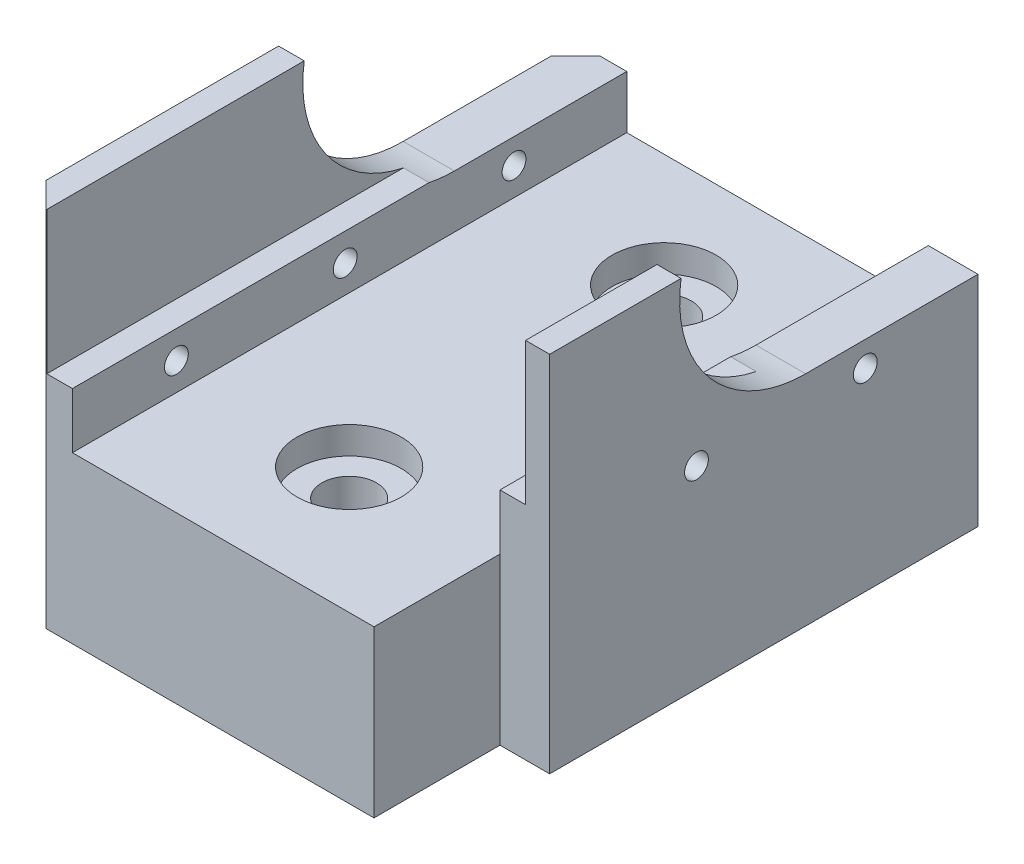
ISO-10303-21;
HEADER;
FILE_DESCRIPTION(('STEP AP214'),'2;1');
FILE_NAME('part.step','',(''),(''),'','','');
FILE_SCHEMA(('AUTOMOTIVE_DESIGN { 1 0 10303 214 1 1 1 1 }'));
ENDSEC;
DATA;
#1=APPLICATION_CONTEXT('core data for automotive mechanical design processes');
#2=APPLICATION_PROTOCOL_DEFINITION('international standard','automotive_design',2000,#1);
#3=PRODUCT_CONTEXT('',#1,'mechanical');
#4=PRODUCT('Part','Part','',(#3));
#5=PRODUCT_RELATED_PRODUCT_CATEGORY('part','',(#4));
#6=PRODUCT_DEFINITION_FORMATION('','',#4);
#7=PRODUCT_DEFINITION_CONTEXT('part definition',#1,'design');
#8=PRODUCT_DEFINITION('design','',#6,#7);
#9=PRODUCT_DEFINITION_SHAPE('','',#8);
#10=(LENGTH_UNIT() NAMED_UNIT(*) SI_UNIT(.MILLI.,.METRE.));
#11=(NAMED_UNIT(*) PLANE_ANGLE_UNIT() SI_UNIT($,.RADIAN.));
#12=(NAMED_UNIT(*) SI_UNIT($,.STERADIAN.) SOLID_ANGLE_UNIT());
#13=UNCERTAINTY_MEASURE_WITH_UNIT(LENGTH_MEASURE(1.E-05),#10,'distance_accuracy_value','');
#14=(GEOMETRIC_REPRESENTATION_CONTEXT(3) GLOBAL_UNCERTAINTY_ASSIGNED_CONTEXT((#13)) GLOBAL_UNIT_ASSIGNED_CONTEXT((#10,
#11,#12)) REPRESENTATION_CONTEXT('',''));
#15=CARTESIAN_POINT('',(0.,0.,0.));
#16=DIRECTION('',(0.,0.,1.));
#17=DIRECTION('',(1.,0.,0.));
#18=AXIS2_PLACEMENT_3D('',#15,#16,#17);
#19=CARTESIAN_POINT('',(15.1999954,27.305,-30.48));
#20=DIRECTION('',(1.,0.,0.));
#21=DIRECTION('',(0.,0.,-1.));
#22=AXIS2_PLACEMENT_3D('',#19,#20,#21);
#23=PLANE('',#22);
#24=CARTESIAN_POINT('',(15.1999954,10.16,-19.1188086));
#25=DIRECTION('',(1.,0.,0.));
#26=DIRECTION('',(0.,0.,-1.));
#27=AXIS2_PLACEMENT_3D('',#24,#25,#26);
#28=CIRCLE('',#27,1.19999999999999);
#29=CARTESIAN_POINT('',(15.1999954,10.16,-20.3188086));
#30=VERTEX_POINT('',#29);
#31=EDGE_CURVE('E260',#30,#30,#28,.T.);
#32=ORIENTED_EDGE('',*,*,#31,.T.);
#33=EDGE_LOOP('',(#32));
#34=FACE_BOUND('',#33,.T.);
#35=CARTESIAN_POINT('',(15.1999954,10.16,-2.1008086));
#36=DIRECTION('',(1.,0.,0.));
#37=DIRECTION('',(0.,0.,-1.));
#38=AXIS2_PLACEMENT_3D('',#35,#36,#37);
#39=CIRCLE('',#38,1.19999999999999);
#40=CARTESIAN_POINT('',(15.1999954,10.16,-3.3008086));
#41=VERTEX_POINT('',#40);
#42=EDGE_CURVE('E250',#41,#41,#39,.T.);
#43=ORIENTED_EDGE('',*,*,#42,.T.);
#44=EDGE_LOOP('',(#43));
#45=FACE_BOUND('',#44,.T.);
#46=DIRECTION('',(0.,-1.,0.));
#47=VECTOR('',#46,1.);
#48=CARTESIAN_POINT('',(15.1999954,-9.325,12.7000000000002));
#49=LINE('',#48,#47);
#50=CARTESIAN_POINT('',(15.1999954,12.9600198000048,12.7000000000002));
#51=VERTEX_POINT('',#50);
#52=CARTESIAN_POINT('',(15.1999954,7.3600056,12.7000000000002));
#53=VERTEX_POINT('',#52);
#54=EDGE_CURVE('E475',#51,#53,#49,.T.);
#55=ORIENTED_EDGE('',*,*,#54,.F.);
#56=DIRECTION('',(0.,0.,-1.));
#57=VECTOR('',#56,1.);
#58=CARTESIAN_POINT('',(15.1999954,12.9600198000048,-30.48));
#59=LINE('',#58,#57);
#60=CARTESIAN_POINT('',(15.1999954,12.9600198000048,-10.5482652898117));
#61=VERTEX_POINT('',#60);
#62=EDGE_CURVE('E268',#51,#61,#59,.T.);
#63=ORIENTED_EDGE('',*,*,#62,.T.);
#64=CARTESIAN_POINT('',(15.1999954,25.4,-13.105000048));
#65=DIRECTION('',(1.,0.,0.));
#66=DIRECTION('',(0.,0.,-1.));
#67=AXIS2_PLACEMENT_3D('',#64,#65,#66);
#68=CIRCLE('',#67,12.7);
#69=CARTESIAN_POINT('',(15.1999954,12.7,-13.105000048));
#70=VERTEX_POINT('',#69);
#71=EDGE_CURVE('E224',#61,#70,#68,.T.);
#72=ORIENTED_EDGE('',*,*,#71,.T.);
#73=DIRECTION('',(0.,0.,-1.));
#74=VECTOR('',#73,1.);
#75=CARTESIAN_POINT('',(15.1999954,12.7,-30.48));
#76=LINE('',#75,#74);
#77=CARTESIAN_POINT('',(15.1999954,12.7,-30.48));
#78=VERTEX_POINT('',#77);
#79=EDGE_CURVE('E273',#70,#78,#76,.T.);
#80=ORIENTED_EDGE('',*,*,#79,.T.);
#81=DIRECTION('',(0.,-1.,0.));
#82=VECTOR('',#81,1.);
#83=CARTESIAN_POINT('',(15.1999954,27.305,-30.48));
#84=LINE('',#83,#82);
#85=CARTESIAN_POINT('',(15.1999954,7.3600056,-30.48));
#86=VERTEX_POINT('',#85);
#87=EDGE_CURVE('E254',#78,#86,#84,.T.);
#88=ORIENTED_EDGE('',*,*,#87,.T.);
#89=DIRECTION('',(0.,0.,-1.));
#90=VECTOR('',#89,1.);
#91=CARTESIAN_POINT('',(15.1999954,7.3600056,30.4800000000251));
#92=LINE('',#91,#90);
#93=EDGE_CURVE('E320',#53,#86,#92,.T.);
#94=ORIENTED_EDGE('',*,*,#93,.F.);
#95=EDGE_LOOP('',(#55,#63,#72,#80,#88,#94));
#96=FACE_BOUND('',#95,.T.);
#97=ADVANCED_FACE('F41',(#34,#45,#96),#23,.F.);
#98=CARTESIAN_POINT('',(0.,27.305,0.));
#99=DIRECTION('',(0.,1.,0.));
#100=DIRECTION('',(0.,0.,1.));
#101=AXIS2_PLACEMENT_3D('',#98,#99,#100);
#102=PLANE('',#101);
#103=DIRECTION('',(0.,0.,-1.));
#104=VECTOR('',#103,1.);
#105=CARTESIAN_POINT('',(20.2059999740001,27.3050000000126,25.4000000000002));
#106=LINE('',#105,#104);
#107=CARTESIAN_POINT('',(20.2059999740001,27.3050000000126,12.7000000000002));
#108=VERTEX_POINT('',#107);
#109=CARTESIAN_POINT('',(20.2059999740001,27.3050000000126,-0.548687890365808));
#110=VERTEX_POINT('',#109);
#111=EDGE_CURVE('E56',#108,#110,#106,.T.);
#112=ORIENTED_EDGE('',*,*,#111,.T.);
#113=DIRECTION('',(1.,0.,0.));
#114=VECTOR('',#113,1.);
#115=CARTESIAN_POINT('',(-22.86,27.305,-0.548687890363903));
#116=LINE('',#115,#114);
#117=CARTESIAN_POINT('',(17.78,27.3050000000126,-0.548687890365808));
#118=VERTEX_POINT('',#117);
#119=EDGE_CURVE('E227',#118,#110,#116,.T.);
#120=ORIENTED_EDGE('',*,*,#119,.F.);
#121=DIRECTION('',(0.,0.,-1.));
#122=VECTOR('',#121,1.);
#123=CARTESIAN_POINT('',(17.78,27.3050000000126,400000.));
#124=LINE('',#123,#122);
#125=CARTESIAN_POINT('',(17.78,27.3050000000126,12.7000000000002));
#126=VERTEX_POINT('',#125);
#127=EDGE_CURVE('E234',#126,#118,#124,.T.);
#128=ORIENTED_EDGE('',*,*,#127,.F.);
#129=DIRECTION('',(-1.,0.,0.));
#130=VECTOR('',#129,1.);
#131=CARTESIAN_POINT('',(15.1999954,27.3050000000126,12.7000000000002));
#132=LINE('',#131,#130);
#133=EDGE_CURVE('E472',#108,#126,#132,.T.);
#134=ORIENTED_EDGE('',*,*,#133,.F.);
#135=EDGE_LOOP('',(#112,#120,#128,#134));
#136=FACE_BOUND('',#135,.T.);
#137=ADVANCED_FACE('F406',(#136),#102,.T.);
#138=CARTESIAN_POINT('',(17.78,0.,0.));
#139=DIRECTION('',(-1.,0.,0.));
#140=DIRECTION('',(0.,0.,1.));
#141=AXIS2_PLACEMENT_3D('',#138,#139,#140);
#142=PLANE('',#141);
#143=DIRECTION('',(0.,0.,1.));
#144=VECTOR('',#143,1.);
#145=CARTESIAN_POINT('',(17.78,12.9600198000048,400000.));
#146=LINE('',#145,#144);
#147=CARTESIAN_POINT('',(17.78,12.9600198000048,-10.5482652898117));
#148=VERTEX_POINT('',#147);
#149=CARTESIAN_POINT('',(17.78,12.9600198000048,12.6999999999953));
#150=VERTEX_POINT('',#149);
#151=EDGE_CURVE('E236',#148,#150,#146,.T.);
#152=ORIENTED_EDGE('',*,*,#151,.T.);
#153=DIRECTION('',(0.,1.,0.));
#154=VECTOR('',#153,1.);
#155=CARTESIAN_POINT('',(17.78,0.,12.7000000000002));
#156=LINE('',#155,#154);
#157=EDGE_CURVE('E480',#150,#126,#156,.T.);
#158=ORIENTED_EDGE('',*,*,#157,.T.);
#159=ORIENTED_EDGE('',*,*,#127,.T.);
#160=CARTESIAN_POINT('',(17.78,25.4,-13.105000048));
#161=DIRECTION('',(-1.,0.,0.));
#162=DIRECTION('',(0.,0.,1.));
#163=AXIS2_PLACEMENT_3D('',#160,#161,#162);
#164=CIRCLE('',#163,12.7);
#165=EDGE_CURVE('E221',#148,#118,#164,.T.);
#166=ORIENTED_EDGE('',*,*,#165,.F.);
#167=EDGE_LOOP('',(#152,#158,#159,#166));
#168=FACE_BOUND('',#167,.T.);
#169=ADVANCED_FACE('F413',(#168),#142,.T.);
#170=CARTESIAN_POINT('',(17.78,12.9600198000048,400000.));
#171=DIRECTION('',(0.,-1.,0.));
#172=DIRECTION('',(0.,0.,-1.));
#173=AXIS2_PLACEMENT_3D('',#170,#171,#172);
#174=PLANE('',#173);
#175=DIRECTION('',(-1.,0.,0.));
#176=VECTOR('',#175,1.);
#177=CARTESIAN_POINT('',(17.78,12.9600198000048,12.6999999999953));
#178=LINE('',#177,#176);
#179=EDGE_CURVE('E478',#150,#51,#178,.T.);
#180=ORIENTED_EDGE('',*,*,#179,.F.);
#181=ORIENTED_EDGE('',*,*,#151,.F.);
#182=DIRECTION('',(1.,0.,0.));
#183=VECTOR('',#182,1.);
#184=CARTESIAN_POINT('',(-22.86,12.9600198000048,-10.5482652898117));
#185=LINE('',#184,#183);
#186=EDGE_CURVE('E218',#148,#61,#185,.F.);
#187=ORIENTED_EDGE('',*,*,#186,.T.);
#188=ORIENTED_EDGE('',*,*,#62,.F.);
#189=EDGE_LOOP('',(#180,#181,#187,#188));
#190=FACE_BOUND('',#189,.T.);
#191=ADVANCED_FACE('F428',(#190),#174,.F.);
#192=CARTESIAN_POINT('',(-15.1999954,27.305,-30.48));
#193=DIRECTION('',(-1.,0.,0.));
#194=DIRECTION('',(0.,0.,1.));
#195=AXIS2_PLACEMENT_3D('',#192,#193,#194);
#196=PLANE('',#195);
#197=CARTESIAN_POINT('',(-15.1999954,10.16,-2.1008086));
#198=DIRECTION('',(-1.,0.,0.));
#199=DIRECTION('',(0.,0.,1.));
#200=AXIS2_PLACEMENT_3D('',#197,#198,#199);
#201=CIRCLE('',#200,1.19999999999999);
#202=CARTESIAN_POINT('',(-15.1999954,10.16,-0.900808600000012));
#203=VERTEX_POINT('',#202);
#204=EDGE_CURVE('E247',#203,#203,#201,.T.);
#205=ORIENTED_EDGE('',*,*,#204,.T.);
#206=EDGE_LOOP('',(#205));
#207=FACE_BOUND('',#206,.T.);
#208=CARTESIAN_POINT('',(-15.1999954,10.16,14.9171914));
#209=DIRECTION('',(-1.,0.,0.));
#210=DIRECTION('',(0.,0.,1.));
#211=AXIS2_PLACEMENT_3D('',#208,#209,#210);
#212=CIRCLE('',#211,1.19999999999999);
#213=CARTESIAN_POINT('',(-15.1999954,10.16,16.1171914));
#214=VERTEX_POINT('',#213);
#215=EDGE_CURVE('E253',#214,#214,#212,.T.);
#216=ORIENTED_EDGE('',*,*,#215,.T.);
#217=EDGE_LOOP('',(#216));
#218=FACE_BOUND('',#217,.T.);
#219=CARTESIAN_POINT('',(-15.1999954,10.16,-19.1188086));
#220=DIRECTION('',(-1.,0.,0.));
#221=DIRECTION('',(0.,0.,1.));
#222=AXIS2_PLACEMENT_3D('',#219,#220,#221);
#223=CIRCLE('',#222,1.19999999999999);
#224=CARTESIAN_POINT('',(-15.1999954,10.16,-17.9188086));
#225=VERTEX_POINT('',#224);
#226=EDGE_CURVE('E265',#225,#225,#223,.T.);
#227=ORIENTED_EDGE('',*,*,#226,.T.);
#228=EDGE_LOOP('',(#227));
#229=FACE_BOUND('',#228,.T.);
#230=DIRECTION('',(0.,1.,0.));
#231=VECTOR('',#230,1.);
#232=CARTESIAN_POINT('',(-15.1999954,27.305,25.4000000000001));
#233=LINE('',#232,#231);
#234=CARTESIAN_POINT('',(-15.1999954,7.3600056,25.4000000000001));
#235=VERTEX_POINT('',#234);
#236=CARTESIAN_POINT('',(-15.1999954,12.9600198000048,25.4000000000001));
#237=VERTEX_POINT('',#236);
#238=EDGE_CURVE('E317',#235,#237,#233,.T.);
#239=ORIENTED_EDGE('',*,*,#238,.F.);
#240=DIRECTION('',(0.,0.,1.));
#241=VECTOR('',#240,1.);
#242=CARTESIAN_POINT('',(-15.1999954,7.3600056,30.4800000000251));
#243=LINE('',#242,#241);
#244=CARTESIAN_POINT('',(-15.1999954,7.3600056,-30.48));
#245=VERTEX_POINT('',#244);
#246=EDGE_CURVE('E316',#245,#235,#243,.T.);
#247=ORIENTED_EDGE('',*,*,#246,.F.);
#248=DIRECTION('',(0.,-1.,0.));
#249=VECTOR('',#248,1.);
#250=CARTESIAN_POINT('',(-15.1999954,27.305,-30.48));
#251=LINE('',#250,#249);
#252=CARTESIAN_POINT('',(-15.1999954,12.7,-30.48));
#253=VERTEX_POINT('',#252);
#254=EDGE_CURVE('E257',#253,#245,#251,.T.);
#255=ORIENTED_EDGE('',*,*,#254,.F.);
#256=DIRECTION('',(0.,0.,1.));
#257=VECTOR('',#256,1.);
#258=CARTESIAN_POINT('',(-15.1999954,12.7,-30.48));
#259=LINE('',#258,#257);
#260=CARTESIAN_POINT('',(-15.1999954,12.7,-13.105000048));
#261=VERTEX_POINT('',#260);
#262=EDGE_CURVE('E230',#253,#261,#259,.T.);
#263=ORIENTED_EDGE('',*,*,#262,.T.);
#264=CARTESIAN_POINT('',(-15.1999954,25.4,-13.105000048));
#265=DIRECTION('',(-1.,0.,0.));
#266=DIRECTION('',(0.,0.,1.));
#267=AXIS2_PLACEMENT_3D('',#264,#265,#266);
#268=CIRCLE('',#267,12.7);
#269=CARTESIAN_POINT('',(-15.1999954,12.9600198000048,-10.5482652898117));
#270=VERTEX_POINT('',#269);
#271=EDGE_CURVE('E215',#261,#270,#268,.T.);
#272=ORIENTED_EDGE('',*,*,#271,.T.);
#273=DIRECTION('',(0.,0.,1.));
#274=VECTOR('',#273,1.);
#275=CARTESIAN_POINT('',(-15.1999954,12.9600198000048,-30.48));
#276=LINE('',#275,#274);
#277=EDGE_CURVE('E240',#270,#237,#276,.T.);
#278=ORIENTED_EDGE('',*,*,#277,.T.);
#279=EDGE_LOOP('',(#239,#247,#255,#263,#272,#278));
#280=FACE_BOUND('',#279,.T.);
#281=ADVANCED_FACE('F314',(#207,#218,#229,#280),#196,.F.);
#282=CARTESIAN_POINT('',(0.,27.305,0.));
#283=DIRECTION('',(0.,1.,0.));
#284=DIRECTION('',(0.,0.,1.));
#285=AXIS2_PLACEMENT_3D('',#282,#283,#284);
#286=PLANE('',#285);
#287=DIRECTION('',(0.,0.,1.));
#288=VECTOR('',#287,1.);
#289=CARTESIAN_POINT('',(-20.3599999999999,27.3050000000126,-30.48));
#290=LINE('',#289,#288);
#291=CARTESIAN_POINT('',(-20.3599999999999,27.3050000000126,-0.548687890365808));
#292=VERTEX_POINT('',#291);
#293=CARTESIAN_POINT('',(-20.3599999999999,27.3050000000126,22.9000000000002));
#294=VERTEX_POINT('',#293);
#295=EDGE_CURVE('E453',#292,#294,#290,.T.);
#296=ORIENTED_EDGE('',*,*,#295,.T.);
#297=DIRECTION('',(0.707106781186543,0.,0.707106781186552));
#298=VECTOR('',#297,1.);
#299=CARTESIAN_POINT('',(-21.6300000000002,27.305,21.6299999999999));
#300=LINE('',#299,#298);
#301=CARTESIAN_POINT('',(-17.8600000000002,27.3050000000126,25.4));
#302=VERTEX_POINT('',#301);
#303=EDGE_CURVE('E285',#294,#302,#300,.T.);
#304=ORIENTED_EDGE('',*,*,#303,.T.);
#305=DIRECTION('',(-1.,0.,0.));
#306=VECTOR('',#305,1.);
#307=CARTESIAN_POINT('',(-22.8599999999999,27.3050000000126,25.4));
#308=LINE('',#307,#306);
#309=CARTESIAN_POINT('',(-17.78,27.3050000000126,25.4));
#310=VERTEX_POINT('',#309);
#311=EDGE_CURVE('E483',#310,#302,#308,.T.);
#312=ORIENTED_EDGE('',*,*,#311,.F.);
#313=DIRECTION('',(0.,0.,-1.));
#314=VECTOR('',#313,1.);
#315=CARTESIAN_POINT('',(-17.78,27.3050000000126,400000.));
#316=LINE('',#315,#314);
#317=CARTESIAN_POINT('',(-17.78,27.3050000000126,-0.548687890365808));
#318=VERTEX_POINT('',#317);
#319=EDGE_CURVE('E233',#310,#318,#316,.T.);
#320=ORIENTED_EDGE('',*,*,#319,.T.);
#321=DIRECTION('',(1.,0.,0.));
#322=VECTOR('',#321,1.);
#323=CARTESIAN_POINT('',(-22.86,27.305,-0.548687890363903));
#324=LINE('',#323,#322);
#325=EDGE_CURVE('E213',#292,#318,#324,.T.);
#326=ORIENTED_EDGE('',*,*,#325,.F.);
#327=EDGE_LOOP('',(#296,#304,#312,#320,#326));
#328=FACE_BOUND('',#327,.T.);
#329=ADVANCED_FACE('F421',(#328),#286,.T.);
#330=DIRECTION('',(-1.,0.,0.));
#331=VECTOR('',#330,1.);
#332=CARTESIAN_POINT('',(17.7800000041279,12.9600198000048,25.3999999999905));
#333=LINE('',#332,#331);
#334=CARTESIAN_POINT('',(-17.78,12.9600198000048,25.3999999999902));
#335=VERTEX_POINT('',#334);
#336=EDGE_CURVE('E351',#237,#335,#333,.T.);
#337=ORIENTED_EDGE('',*,*,#336,.F.);
#338=ORIENTED_EDGE('',*,*,#277,.F.);
#339=DIRECTION('',(1.,0.,0.));
#340=VECTOR('',#339,1.);
#341=CARTESIAN_POINT('',(-22.86,12.9600198000048,-10.5482652898117));
#342=LINE('',#341,#340);
#343=CARTESIAN_POINT('',(-17.78,12.9600198000048,-10.5482652898117));
#344=VERTEX_POINT('',#343);
#345=EDGE_CURVE('E209',#270,#344,#342,.F.);
#346=ORIENTED_EDGE('',*,*,#345,.T.);
#347=DIRECTION('',(0.,0.,1.));
#348=VECTOR('',#347,1.);
#349=CARTESIAN_POINT('',(-17.78,12.9600198000048,400000.));
#350=LINE('',#349,#348);
#351=EDGE_CURVE('E237',#344,#335,#350,.T.);
#352=ORIENTED_EDGE('',*,*,#351,.T.);
#353=EDGE_LOOP('',(#337,#338,#346,#352));
#354=FACE_BOUND('',#353,.T.);
#355=ADVANCED_FACE('F424',(#354),#174,.F.);
#356=CARTESIAN_POINT('',(-17.78,0.,0.));
#357=DIRECTION('',(-1.,0.,0.));
#358=DIRECTION('',(0.,0.,1.));
#359=AXIS2_PLACEMENT_3D('',#356,#357,#358);
#360=PLANE('',#359);
#361=DIRECTION('',(0.,1.,0.));
#362=VECTOR('',#361,1.);
#363=CARTESIAN_POINT('',(-17.78,0.,25.4));
#364=LINE('',#363,#362);
#365=EDGE_CURVE('E346',#335,#310,#364,.T.);
#366=ORIENTED_EDGE('',*,*,#365,.F.);
#367=ORIENTED_EDGE('',*,*,#351,.F.);
#368=CARTESIAN_POINT('',(-17.78,25.4,-13.105000048));
#369=DIRECTION('',(-1.,0.,0.));
#370=DIRECTION('',(0.,0.,1.));
#371=AXIS2_PLACEMENT_3D('',#368,#369,#370);
#372=CIRCLE('',#371,12.7);
#373=EDGE_CURVE('E270',#344,#318,#372,.T.);
#374=ORIENTED_EDGE('',*,*,#373,.T.);
#375=ORIENTED_EDGE('',*,*,#319,.F.);
#376=EDGE_LOOP('',(#366,#367,#374,#375));
#377=FACE_BOUND('',#376,.T.);
#378=ADVANCED_FACE('F493',(#377),#360,.F.);
#379=CARTESIAN_POINT('',(0.,-9.325,0.));
#380=DIRECTION('',(0.,-1.,0.));
#381=DIRECTION('',(0.,0.,-1.));
#382=AXIS2_PLACEMENT_3D('',#379,#380,#381);
#383=PLANE('',#382);
#384=DIRECTION('',(0.,0.,-1.));
#385=VECTOR('',#384,1.);
#386=CARTESIAN_POINT('',(20.2059999740001,-9.325,25.4000000000002));
#387=LINE('',#386,#385);
#388=CARTESIAN_POINT('',(20.2059999740001,-9.325,12.7000000000002));
#389=VERTEX_POINT('',#388);
#390=CARTESIAN_POINT('',(20.2059999740001,-9.325,-30.48));
#391=VERTEX_POINT('',#390);
#392=EDGE_CURVE('E173',#389,#391,#387,.T.);
#393=ORIENTED_EDGE('',*,*,#392,.F.);
#394=DIRECTION('',(1.,0.,0.));
#395=VECTOR('',#394,1.);
#396=CARTESIAN_POINT('',(15.1999954,-9.325,12.7000000000002));
#397=LINE('',#396,#395);
#398=CARTESIAN_POINT('',(15.1999954,-9.325,12.7000000000002));
#399=VERTEX_POINT('',#398);
#400=EDGE_CURVE('E470',#399,#389,#397,.T.);
#401=ORIENTED_EDGE('',*,*,#400,.F.);
#402=DIRECTION('',(0.,0.,1.));
#403=VECTOR('',#402,1.);
#404=CARTESIAN_POINT('',(15.1999954,-9.325,12.7000000000002));
#405=LINE('',#404,#403);
#406=CARTESIAN_POINT('',(15.1999954,-9.325,25.4000000000002));
#407=VERTEX_POINT('',#406);
#408=EDGE_CURVE('E476',#399,#407,#405,.T.);
#409=ORIENTED_EDGE('',*,*,#408,.T.);
#410=DIRECTION('',(-1.,0.,0.));
#411=VECTOR('',#410,1.);
#412=CARTESIAN_POINT('',(-2.62135991925387E-13,-9.325,25.4000000000002));
#413=LINE('',#412,#411);
#414=CARTESIAN_POINT('',(-17.8600000000002,-9.325,25.4));
#415=VERTEX_POINT('',#414);
#416=EDGE_CURVE('E342',#407,#415,#413,.T.);
#417=ORIENTED_EDGE('',*,*,#416,.T.);
#418=DIRECTION('',(-0.707106781186543,0.,-0.707106781186552));
#419=VECTOR('',#418,1.);
#420=CARTESIAN_POINT('',(-21.6300000000002,-9.325,21.6299999999999));
#421=LINE('',#420,#419);
#422=CARTESIAN_POINT('',(-20.3599999999999,-9.325,22.9000000000002));
#423=VERTEX_POINT('',#422);
#424=EDGE_CURVE('E290',#415,#423,#421,.T.);
#425=ORIENTED_EDGE('',*,*,#424,.T.);
#426=DIRECTION('',(0.,0.,1.));
#427=VECTOR('',#426,1.);
#428=CARTESIAN_POINT('',(-20.3599999999999,-9.325,-30.48));
#429=LINE('',#428,#427);
#430=CARTESIAN_POINT('',(-20.3599999999999,-9.325,-27.98));
#431=VERTEX_POINT('',#430);
#432=EDGE_CURVE('E307',#431,#423,#429,.T.);
#433=ORIENTED_EDGE('',*,*,#432,.F.);
#434=DIRECTION('',(-0.707106781186547,0.,0.707106781186548));
#435=VECTOR('',#434,1.);
#436=CARTESIAN_POINT('',(-24.17,-9.325,-24.1699999999999));
#437=LINE('',#436,#435);
#438=CARTESIAN_POINT('',(-17.86,-9.325,-30.48));
#439=VERTEX_POINT('',#438);
#440=EDGE_CURVE('E196',#431,#439,#437,.F.);
#441=ORIENTED_EDGE('',*,*,#440,.T.);
#442=DIRECTION('',(1.,0.,0.));
#443=VECTOR('',#442,1.);
#444=CARTESIAN_POINT('',(-22.86,-9.325,-30.48));
#445=LINE('',#444,#443);
#446=EDGE_CURVE('E188',#439,#391,#445,.T.);
#447=ORIENTED_EDGE('',*,*,#446,.T.);
#448=EDGE_LOOP('',(#393,#401,#409,#417,#425,#433,#441,#447));
#449=FACE_BOUND('',#448,.T.);
#450=CARTESIAN_POINT('',(0.,-9.325,12.7));
#451=DIRECTION('',(0.,1.,0.));
#452=DIRECTION('',(0.,0.,1.));
#453=AXIS2_PLACEMENT_3D('',#450,#451,#452);
#454=CIRCLE('',#453,2.75);
#455=CARTESIAN_POINT('',(0.,-9.325,15.45));
#456=VERTEX_POINT('',#455);
#457=EDGE_CURVE('E360',#456,#456,#454,.T.);
#458=ORIENTED_EDGE('',*,*,#457,.T.);
#459=EDGE_LOOP('',(#458));
#460=FACE_BOUND('',#459,.T.);
#461=CARTESIAN_POINT('',(0.,-9.325,-19.05));
#462=DIRECTION('',(0.,1.,0.));
#463=DIRECTION('',(0.,0.,1.));
#464=AXIS2_PLACEMENT_3D('',#461,#462,#463);
#465=CIRCLE('',#464,2.75);
#466=CARTESIAN_POINT('',(0.,-9.325,-16.3));
#467=VERTEX_POINT('',#466);
#468=EDGE_CURVE('E321',#467,#467,#465,.T.);
#469=ORIENTED_EDGE('',*,*,#468,.T.);
#470=EDGE_LOOP('',(#469));
#471=FACE_BOUND('',#470,.T.);
#472=ADVANCED_FACE('F192',(#449,#460,#471),#383,.T.);
#473=CARTESIAN_POINT('',(0.,7.3600056,0.));
#474=DIRECTION('',(0.,-1.,0.));
#475=DIRECTION('',(0.,0.,-1.));
#476=AXIS2_PLACEMENT_3D('',#473,#474,#475);
#477=PLANE('',#476);
#478=CARTESIAN_POINT('',(0.,7.3600056,-19.05));
#479=DIRECTION('',(0.,1.,0.));
#480=DIRECTION('',(0.,0.,1.));
#481=AXIS2_PLACEMENT_3D('',#478,#479,#480);
#482=CIRCLE('',#481,5.24999999999999);
#483=CARTESIAN_POINT('',(0.,7.3600056,-13.8));
#484=VERTEX_POINT('',#483);
#485=EDGE_CURVE('E363',#484,#484,#482,.T.);
#486=ORIENTED_EDGE('',*,*,#485,.F.);
#487=EDGE_LOOP('',(#486));
#488=FACE_BOUND('',#487,.T.);
#489=CARTESIAN_POINT('',(0.,7.3600056,12.7));
#490=DIRECTION('',(0.,1.,0.));
#491=DIRECTION('',(0.,0.,1.));
#492=AXIS2_PLACEMENT_3D('',#489,#490,#491);
#493=CIRCLE('',#492,5.24999999999999);
#494=CARTESIAN_POINT('',(0.,7.3600056,17.95));
#495=VERTEX_POINT('',#494);
#496=EDGE_CURVE('E345',#495,#495,#493,.T.);
#497=ORIENTED_EDGE('',*,*,#496,.F.);
#498=EDGE_LOOP('',(#497));
#499=FACE_BOUND('',#498,.T.);
#500=DIRECTION('',(-1.,0.,0.));
#501=VECTOR('',#500,1.);
#502=CARTESIAN_POINT('',(-2.62135991925387E-13,7.3600056,25.4000000000002));
#503=LINE('',#502,#501);
#504=CARTESIAN_POINT('',(15.1999954,7.3600056,25.4000000000002));
#505=VERTEX_POINT('',#504);
#506=EDGE_CURVE('E276',#505,#235,#503,.T.);
#507=ORIENTED_EDGE('',*,*,#506,.F.);
#508=EDGE_CURVE('E204',#505,#53,#92,.T.);
#509=ORIENTED_EDGE('',*,*,#508,.T.);
#510=ORIENTED_EDGE('',*,*,#93,.T.);
#511=DIRECTION('',(-1.,0.,0.));
#512=VECTOR('',#511,1.);
#513=CARTESIAN_POINT('',(-15.1999954,7.3600056,-30.48));
#514=LINE('',#513,#512);
#515=EDGE_CURVE('E198',#86,#245,#514,.T.);
#516=ORIENTED_EDGE('',*,*,#515,.T.);
#517=ORIENTED_EDGE('',*,*,#246,.T.);
#518=EDGE_LOOP('',(#507,#509,#510,#516,#517));
#519=FACE_BOUND('',#518,.T.);
#520=ADVANCED_FACE('F328',(#488,#499,#519),#477,.F.);
#521=CARTESIAN_POINT('',(22.86,10.16,-19.1188086));
#522=DIRECTION('',(1.,0.,0.));
#523=DIRECTION('',(0.,0.,-1.));
#524=AXIS2_PLACEMENT_3D('',#521,#522,#523);
#525=CYLINDRICAL_SURFACE('',#524,1.19999999999999);
#526=CARTESIAN_POINT('',(-20.3599999999999,10.16,-19.1188086));
#527=DIRECTION('',(1.,0.,0.));
#528=DIRECTION('',(0.,1.,0.));
#529=AXIS2_PLACEMENT_3D('',#526,#527,#528);
#530=CIRCLE('',#529,1.19999999999999);
#531=CARTESIAN_POINT('',(-20.3599999999999,11.36,-19.1188086));
#532=VERTEX_POINT('',#531);
#533=EDGE_CURVE('E467',#532,#532,#530,.F.);
#534=ORIENTED_EDGE('',*,*,#533,.T.);
#535=EDGE_LOOP('',(#534));
#536=FACE_BOUND('',#535,.T.);
#537=ORIENTED_EDGE('',*,*,#226,.F.);
#538=EDGE_LOOP('',(#537));
#539=FACE_BOUND('',#538,.T.);
#540=ADVANCED_FACE('F388',(#536,#539),#525,.F.);
#541=CARTESIAN_POINT('',(22.86,10.16,-19.1188086));
#542=DIRECTION('',(1.,0.,0.));
#543=DIRECTION('',(0.,0.,-1.));
#544=AXIS2_PLACEMENT_3D('',#541,#542,#543);
#545=CYLINDRICAL_SURFACE('',#544,1.19999999999999);
#546=CARTESIAN_POINT('',(20.2059999740001,10.16,-19.1188086));
#547=DIRECTION('',(-1.,0.,0.));
#548=DIRECTION('',(0.,0.,1.));
#549=AXIS2_PLACEMENT_3D('',#546,#547,#548);
#550=CIRCLE('',#549,1.19999999999999);
#551=CARTESIAN_POINT('',(20.2059999740001,10.16,-17.9188086));
#552=VERTEX_POINT('',#551);
#553=EDGE_CURVE('E455',#552,#552,#550,.F.);
#554=ORIENTED_EDGE('',*,*,#553,.T.);
#555=EDGE_LOOP('',(#554));
#556=FACE_BOUND('',#555,.T.);
#557=ORIENTED_EDGE('',*,*,#31,.F.);
#558=EDGE_LOOP('',(#557));
#559=FACE_BOUND('',#558,.T.);
#560=ADVANCED_FACE('F432',(#556,#559),#545,.F.);
#561=CARTESIAN_POINT('',(-22.86,6.35,-30.48));
#562=DIRECTION('',(0.,0.,1.));
#563=DIRECTION('',(1.,0.,0.));
#564=AXIS2_PLACEMENT_3D('',#561,#562,#563);
#565=PLANE('',#564);
#566=DIRECTION('',(1.,0.,0.));
#567=VECTOR('',#566,1.);
#568=CARTESIAN_POINT('',(-22.86,12.7,-30.48));
#569=LINE('',#568,#567);
#570=CARTESIAN_POINT('',(20.2059999740001,12.7,-30.48));
#571=VERTEX_POINT('',#570);
#572=EDGE_CURVE('E190',#78,#571,#569,.T.);
#573=ORIENTED_EDGE('',*,*,#572,.T.);
#574=DIRECTION('',(0.,1.,0.));
#575=VECTOR('',#574,1.);
#576=CARTESIAN_POINT('',(20.2059999740001,-9.325,-30.48));
#577=LINE('',#576,#575);
#578=EDGE_CURVE('E177',#391,#571,#577,.T.);
#579=ORIENTED_EDGE('',*,*,#578,.F.);
#580=ORIENTED_EDGE('',*,*,#446,.F.);
#581=DIRECTION('',(0.,1.,0.));
#582=VECTOR('',#581,1.);
#583=CARTESIAN_POINT('',(-17.86,6.35,-30.48));
#584=LINE('',#583,#582);
#585=CARTESIAN_POINT('',(-17.86,12.7,-30.48));
#586=VERTEX_POINT('',#585);
#587=EDGE_CURVE('E292',#439,#586,#584,.T.);
#588=ORIENTED_EDGE('',*,*,#587,.T.);
#589=EDGE_CURVE('E208',#586,#253,#569,.T.);
#590=ORIENTED_EDGE('',*,*,#589,.T.);
#591=ORIENTED_EDGE('',*,*,#254,.T.);
#592=ORIENTED_EDGE('',*,*,#515,.F.);
#593=ORIENTED_EDGE('',*,*,#87,.F.);
#594=EDGE_LOOP('',(#573,#579,#580,#588,#590,#591,#592,#593));
#595=FACE_BOUND('',#594,.T.);
#596=ADVANCED_FACE('F187',(#595),#565,.F.);
#597=CARTESIAN_POINT('',(22.86,10.16,14.9171914));
#598=DIRECTION('',(1.,0.,0.));
#599=DIRECTION('',(0.,0.,-1.));
#600=AXIS2_PLACEMENT_3D('',#597,#598,#599);
#601=CYLINDRICAL_SURFACE('',#600,1.19999999999999);
#602=CARTESIAN_POINT('',(-20.3599999999999,10.16,14.9171914));
#603=DIRECTION('',(1.,0.,0.));
#604=DIRECTION('',(0.,1.,0.));
#605=AXIS2_PLACEMENT_3D('',#602,#603,#604);
#606=CIRCLE('',#605,1.19999999999999);
#607=CARTESIAN_POINT('',(-20.3599999999999,11.36,14.9171914));
#608=VERTEX_POINT('',#607);
#609=EDGE_CURVE('E464',#608,#608,#606,.F.);
#610=ORIENTED_EDGE('',*,*,#609,.T.);
#611=EDGE_LOOP('',(#610));
#612=FACE_BOUND('',#611,.T.);
#613=ORIENTED_EDGE('',*,*,#215,.F.);
#614=EDGE_LOOP('',(#613));
#615=FACE_BOUND('',#614,.T.);
#616=ADVANCED_FACE('F418',(#612,#615),#601,.F.);
#617=CARTESIAN_POINT('',(22.86,10.16,-2.1008086));
#618=DIRECTION('',(1.,0.,0.));
#619=DIRECTION('',(0.,0.,-1.));
#620=AXIS2_PLACEMENT_3D('',#617,#618,#619);
#621=CYLINDRICAL_SURFACE('',#620,1.19999999999999);
#622=CARTESIAN_POINT('',(20.2059999740001,10.16,-2.1008086));
#623=DIRECTION('',(-1.,0.,0.));
#624=DIRECTION('',(0.,0.,1.));
#625=AXIS2_PLACEMENT_3D('',#622,#623,#624);
#626=CIRCLE('',#625,1.19999999999999);
#627=CARTESIAN_POINT('',(20.2059999740001,10.16,-0.900808600000012));
#628=VERTEX_POINT('',#627);
#629=EDGE_CURVE('E532',#628,#628,#626,.F.);
#630=ORIENTED_EDGE('',*,*,#629,.T.);
#631=EDGE_LOOP('',(#630));
#632=FACE_BOUND('',#631,.T.);
#633=ORIENTED_EDGE('',*,*,#42,.F.);
#634=EDGE_LOOP('',(#633));
#635=FACE_BOUND('',#634,.T.);
#636=ADVANCED_FACE('F507',(#632,#635),#621,.F.);
#637=CARTESIAN_POINT('',(22.86,10.16,-2.1008086));
#638=DIRECTION('',(1.,0.,0.));
#639=DIRECTION('',(0.,0.,-1.));
#640=AXIS2_PLACEMENT_3D('',#637,#638,#639);
#641=CYLINDRICAL_SURFACE('',#640,1.19999999999999);
#642=CARTESIAN_POINT('',(-20.3599999999999,10.16,-2.1008086));
#643=DIRECTION('',(1.,0.,0.));
#644=DIRECTION('',(0.,1.,0.));
#645=AXIS2_PLACEMENT_3D('',#642,#643,#644);
#646=CIRCLE('',#645,1.19999999999999);
#647=CARTESIAN_POINT('',(-20.3599999999999,11.36,-2.1008086));
#648=VERTEX_POINT('',#647);
#649=EDGE_CURVE('E461',#648,#648,#646,.F.);
#650=ORIENTED_EDGE('',*,*,#649,.T.);
#651=EDGE_LOOP('',(#650));
#652=FACE_BOUND('',#651,.T.);
#653=ORIENTED_EDGE('',*,*,#204,.F.);
#654=EDGE_LOOP('',(#653));
#655=FACE_BOUND('',#654,.T.);
#656=ADVANCED_FACE('F498',(#652,#655),#641,.F.);
#657=CARTESIAN_POINT('',(-22.86,25.4,-13.105000048));
#658=DIRECTION('',(1.,0.,0.));
#659=DIRECTION('',(0.,0.,-1.));
#660=AXIS2_PLACEMENT_3D('',#657,#658,#659);
#661=CYLINDRICAL_SURFACE('',#660,12.7);
#662=DIRECTION('',(1.,0.,0.));
#663=VECTOR('',#662,1.);
#664=CARTESIAN_POINT('',(-22.86,12.7,-13.105000048));
#665=LINE('',#664,#663);
#666=CARTESIAN_POINT('',(-20.3599999999999,12.7,-13.105000048));
#667=VERTEX_POINT('',#666);
#668=EDGE_CURVE('E201',#667,#261,#665,.T.);
#669=ORIENTED_EDGE('',*,*,#668,.F.);
#670=CARTESIAN_POINT('',(-20.3599999999999,25.4,-13.105000048));
#671=DIRECTION('',(1.,0.,0.));
#672=DIRECTION('',(0.,1.,0.));
#673=AXIS2_PLACEMENT_3D('',#670,#671,#672);
#674=CIRCLE('',#673,12.7);
#675=EDGE_CURVE('E305',#667,#292,#674,.F.);
#676=ORIENTED_EDGE('',*,*,#675,.T.);
#677=ORIENTED_EDGE('',*,*,#325,.T.);
#678=ORIENTED_EDGE('',*,*,#373,.F.);
#679=ORIENTED_EDGE('',*,*,#345,.F.);
#680=ORIENTED_EDGE('',*,*,#271,.F.);
#681=EDGE_LOOP('',(#669,#676,#677,#678,#679,#680));
#682=FACE_BOUND('',#681,.T.);
#683=ADVANCED_FACE('F495',(#682),#661,.F.);
#684=CARTESIAN_POINT('',(-22.86,12.7,-13.105000048));
#685=DIRECTION('',(0.,-1.,0.));
#686=DIRECTION('',(0.,0.,-1.));
#687=AXIS2_PLACEMENT_3D('',#684,#685,#686);
#688=PLANE('',#687);
#689=ORIENTED_EDGE('',*,*,#589,.F.);
#690=DIRECTION('',(0.707106781186547,0.,-0.707106781186548));
#691=VECTOR('',#690,1.);
#692=CARTESIAN_POINT('',(-17.86,12.7,-30.48));
#693=LINE('',#692,#691);
#694=CARTESIAN_POINT('',(-20.3599999999999,12.7,-27.98));
#695=VERTEX_POINT('',#694);
#696=EDGE_CURVE('E50',#586,#695,#693,.F.);
#697=ORIENTED_EDGE('',*,*,#696,.T.);
#698=DIRECTION('',(0.,0.,1.));
#699=VECTOR('',#698,1.);
#700=CARTESIAN_POINT('',(-20.3599999999999,12.7,-13.105000048));
#701=LINE('',#700,#699);
#702=EDGE_CURVE('E297',#695,#667,#701,.T.);
#703=ORIENTED_EDGE('',*,*,#702,.T.);
#704=ORIENTED_EDGE('',*,*,#668,.T.);
#705=ORIENTED_EDGE('',*,*,#262,.F.);
#706=EDGE_LOOP('',(#689,#697,#703,#704,#705));
#707=FACE_BOUND('',#706,.T.);
#708=ADVANCED_FACE('F296',(#707),#688,.F.);
#709=CARTESIAN_POINT('',(20.2059999740001,12.7,-13.105000048));
#710=VERTEX_POINT('',#709);
#711=EDGE_CURVE('E197',#70,#710,#665,.T.);
#712=ORIENTED_EDGE('',*,*,#711,.T.);
#713=DIRECTION('',(0.,0.,-1.));
#714=VECTOR('',#713,1.);
#715=CARTESIAN_POINT('',(20.2059999740001,12.7,-13.105000048));
#716=LINE('',#715,#714);
#717=EDGE_CURVE('E529',#710,#571,#716,.T.);
#718=ORIENTED_EDGE('',*,*,#717,.T.);
#719=ORIENTED_EDGE('',*,*,#572,.F.);
#720=ORIENTED_EDGE('',*,*,#79,.F.);
#721=EDGE_LOOP('',(#712,#718,#719,#720));
#722=FACE_BOUND('',#721,.T.);
#723=ADVANCED_FACE('F505',(#722),#688,.F.);
#724=ORIENTED_EDGE('',*,*,#119,.T.);
#725=CARTESIAN_POINT('',(20.2059999740001,25.4,-13.105000048));
#726=DIRECTION('',(-1.,0.,0.));
#727=DIRECTION('',(0.,0.,1.));
#728=AXIS2_PLACEMENT_3D('',#725,#726,#727);
#729=CIRCLE('',#728,12.7);
#730=EDGE_CURVE('E524',#110,#710,#729,.F.);
#731=ORIENTED_EDGE('',*,*,#730,.T.);
#732=ORIENTED_EDGE('',*,*,#711,.F.);
#733=ORIENTED_EDGE('',*,*,#71,.F.);
#734=ORIENTED_EDGE('',*,*,#186,.F.);
#735=ORIENTED_EDGE('',*,*,#165,.T.);
#736=EDGE_LOOP('',(#724,#731,#732,#733,#734,#735));
#737=FACE_BOUND('',#736,.T.);
#738=ADVANCED_FACE('F500',(#737),#661,.F.);
#739=CARTESIAN_POINT('',(0.,7.3600056,-19.05));
#740=DIRECTION('',(0.,1.,0.));
#741=DIRECTION('',(0.,0.,1.));
#742=AXIS2_PLACEMENT_3D('',#739,#740,#741);
#743=CYLINDRICAL_SURFACE('',#742,2.75);
#744=ORIENTED_EDGE('',*,*,#468,.F.);
#745=EDGE_LOOP('',(#744));
#746=FACE_BOUND('',#745,.T.);
#747=CARTESIAN_POINT('',(0.,4.6100056,-19.05));
#748=DIRECTION('',(0.,1.,0.));
#749=DIRECTION('',(0.,0.,1.));
#750=AXIS2_PLACEMENT_3D('',#747,#748,#749);
#751=CIRCLE('',#750,2.75);
#752=CARTESIAN_POINT('',(0.,4.6100056,-16.3));
#753=VERTEX_POINT('',#752);
#754=EDGE_CURVE('E324',#753,#753,#751,.T.);
#755=ORIENTED_EDGE('',*,*,#754,.T.);
#756=EDGE_LOOP('',(#755));
#757=FACE_BOUND('',#756,.T.);
#758=ADVANCED_FACE('F371',(#746,#757),#743,.F.);
#759=CARTESIAN_POINT('',(2.75,4.6100056,-19.05));
#760=DIRECTION('',(0.,-1.,0.));
#761=DIRECTION('',(0.,0.,-1.));
#762=AXIS2_PLACEMENT_3D('',#759,#760,#761);
#763=PLANE('',#762);
#764=ORIENTED_EDGE('',*,*,#754,.F.);
#765=EDGE_LOOP('',(#764));
#766=FACE_BOUND('',#765,.T.);
#767=CARTESIAN_POINT('',(0.,4.6100056,-19.05));
#768=DIRECTION('',(0.,1.,0.));
#769=DIRECTION('',(0.,0.,1.));
#770=AXIS2_PLACEMENT_3D('',#767,#768,#769);
#771=CIRCLE('',#770,5.25);
#772=CARTESIAN_POINT('',(0.,4.6100056,-13.8));
#773=VERTEX_POINT('',#772);
#774=EDGE_CURVE('E366',#773,#773,#771,.T.);
#775=ORIENTED_EDGE('',*,*,#774,.T.);
#776=EDGE_LOOP('',(#775));
#777=FACE_BOUND('',#776,.T.);
#778=ADVANCED_FACE('F373',(#766,#777),#763,.F.);
#779=CARTESIAN_POINT('',(0.,7.3600056,-19.05));
#780=DIRECTION('',(0.,1.,0.));
#781=DIRECTION('',(0.,0.,1.));
#782=AXIS2_PLACEMENT_3D('',#779,#780,#781);
#783=CYLINDRICAL_SURFACE('',#782,5.25);
#784=ORIENTED_EDGE('',*,*,#774,.F.);
#785=EDGE_LOOP('',(#784));
#786=FACE_BOUND('',#785,.T.);
#787=ORIENTED_EDGE('',*,*,#485,.T.);
#788=EDGE_LOOP('',(#787));
#789=FACE_BOUND('',#788,.T.);
#790=ADVANCED_FACE('F376',(#786,#789),#783,.F.);
#791=CARTESIAN_POINT('',(0.,7.3600056,12.7));
#792=DIRECTION('',(0.,1.,0.));
#793=DIRECTION('',(0.,0.,1.));
#794=AXIS2_PLACEMENT_3D('',#791,#792,#793);
#795=CYLINDRICAL_SURFACE('',#794,2.75);
#796=ORIENTED_EDGE('',*,*,#457,.F.);
#797=EDGE_LOOP('',(#796));
#798=FACE_BOUND('',#797,.T.);
#799=CARTESIAN_POINT('',(0.,4.6100056,12.7));
#800=DIRECTION('',(0.,1.,0.));
#801=DIRECTION('',(0.,0.,1.));
#802=AXIS2_PLACEMENT_3D('',#799,#800,#801);
#803=CIRCLE('',#802,2.75);
#804=CARTESIAN_POINT('',(0.,4.6100056,15.45));
#805=VERTEX_POINT('',#804);
#806=EDGE_CURVE('E357',#805,#805,#803,.T.);
#807=ORIENTED_EDGE('',*,*,#806,.T.);
#808=EDGE_LOOP('',(#807));
#809=FACE_BOUND('',#808,.T.);
#810=ADVANCED_FACE('F382',(#798,#809),#795,.F.);
#811=CARTESIAN_POINT('',(2.75,4.6100056,12.7));
#812=DIRECTION('',(0.,-1.,0.));
#813=DIRECTION('',(0.,0.,-1.));
#814=AXIS2_PLACEMENT_3D('',#811,#812,#813);
#815=PLANE('',#814);
#816=ORIENTED_EDGE('',*,*,#806,.F.);
#817=EDGE_LOOP('',(#816));
#818=FACE_BOUND('',#817,.T.);
#819=CARTESIAN_POINT('',(0.,4.6100056,12.7));
#820=DIRECTION('',(0.,1.,0.));
#821=DIRECTION('',(0.,0.,1.));
#822=AXIS2_PLACEMENT_3D('',#819,#820,#821);
#823=CIRCLE('',#822,5.25);
#824=CARTESIAN_POINT('',(0.,4.6100056,17.95));
#825=VERTEX_POINT('',#824);
#826=EDGE_CURVE('E349',#825,#825,#823,.T.);
#827=ORIENTED_EDGE('',*,*,#826,.T.);
#828=EDGE_LOOP('',(#827));
#829=FACE_BOUND('',#828,.T.);
#830=ADVANCED_FACE('F394',(#818,#829),#815,.F.);
#831=CARTESIAN_POINT('',(0.,7.3600056,12.7));
#832=DIRECTION('',(0.,1.,0.));
#833=DIRECTION('',(0.,0.,1.));
#834=AXIS2_PLACEMENT_3D('',#831,#832,#833);
#835=CYLINDRICAL_SURFACE('',#834,5.25);
#836=ORIENTED_EDGE('',*,*,#826,.F.);
#837=EDGE_LOOP('',(#836));
#838=FACE_BOUND('',#837,.T.);
#839=ORIENTED_EDGE('',*,*,#496,.T.);
#840=EDGE_LOOP('',(#839));
#841=FACE_BOUND('',#840,.T.);
#842=ADVANCED_FACE('F392',(#838,#841),#835,.F.);
#843=CARTESIAN_POINT('',(-22.8599999999999,-9.325,25.4));
#844=DIRECTION('',(0.,0.,1.));
#845=DIRECTION('',(1.,0.,0.));
#846=AXIS2_PLACEMENT_3D('',#843,#844,#845);
#847=PLANE('',#846);
#848=ORIENTED_EDGE('',*,*,#311,.T.);
#849=DIRECTION('',(0.,-1.,0.));
#850=VECTOR('',#849,1.);
#851=CARTESIAN_POINT('',(-17.8600000000002,-9.325,25.4));
#852=LINE('',#851,#850);
#853=EDGE_CURVE('E287',#302,#415,#852,.T.);
#854=ORIENTED_EDGE('',*,*,#853,.T.);
#855=ORIENTED_EDGE('',*,*,#416,.F.);
#856=DIRECTION('',(0.,-1.,0.));
#857=VECTOR('',#856,1.);
#858=CARTESIAN_POINT('',(15.1999954,-9.325,25.4000000000004));
#859=LINE('',#858,#857);
#860=EDGE_CURVE('E278',#505,#407,#859,.T.);
#861=ORIENTED_EDGE('',*,*,#860,.F.);
#862=ORIENTED_EDGE('',*,*,#506,.T.);
#863=ORIENTED_EDGE('',*,*,#238,.T.);
#864=ORIENTED_EDGE('',*,*,#336,.T.);
#865=ORIENTED_EDGE('',*,*,#365,.T.);
#866=EDGE_LOOP('',(#848,#854,#855,#861,#862,#863,#864,#865));
#867=FACE_BOUND('',#866,.T.);
#868=ADVANCED_FACE('F340',(#867),#847,.T.);
#869=CARTESIAN_POINT('',(15.1999954,-9.325,12.7000000000002));
#870=DIRECTION('',(-1.,0.,0.));
#871=DIRECTION('',(0.,0.,1.));
#872=AXIS2_PLACEMENT_3D('',#869,#870,#871);
#873=PLANE('',#872);
#874=ORIENTED_EDGE('',*,*,#860,.T.);
#875=ORIENTED_EDGE('',*,*,#408,.F.);
#876=EDGE_CURVE('E335',#53,#399,#49,.T.);
#877=ORIENTED_EDGE('',*,*,#876,.F.);
#878=ORIENTED_EDGE('',*,*,#508,.F.);
#879=EDGE_LOOP('',(#874,#875,#877,#878));
#880=FACE_BOUND('',#879,.T.);
#881=ADVANCED_FACE('F332',(#880),#873,.F.);
#882=CARTESIAN_POINT('',(0.,0.,12.7000000000002));
#883=DIRECTION('',(0.,0.,1.));
#884=DIRECTION('',(1.,0.,0.));
#885=AXIS2_PLACEMENT_3D('',#882,#883,#884);
#886=PLANE('',#885);
#887=DIRECTION('',(0.,-1.,0.));
#888=VECTOR('',#887,1.);
#889=CARTESIAN_POINT('',(20.2059999740001,0.,12.7000000000002));
#890=LINE('',#889,#888);
#891=EDGE_CURVE('E12',#108,#389,#890,.T.);
#892=ORIENTED_EDGE('',*,*,#891,.F.);
#893=ORIENTED_EDGE('',*,*,#133,.T.);
#894=ORIENTED_EDGE('',*,*,#157,.F.);
#895=ORIENTED_EDGE('',*,*,#179,.T.);
#896=ORIENTED_EDGE('',*,*,#54,.T.);
#897=ORIENTED_EDGE('',*,*,#876,.T.);
#898=ORIENTED_EDGE('',*,*,#400,.T.);
#899=EDGE_LOOP('',(#892,#893,#894,#895,#896,#897,#898));
#900=FACE_BOUND('',#899,.T.);
#901=ADVANCED_FACE('F448',(#900),#886,.T.);
#902=CARTESIAN_POINT('',(-20.3599999999999,27.3050000000126,-30.48));
#903=DIRECTION('',(1.,0.,0.));
#904=DIRECTION('',(0.,1.,0.));
#905=AXIS2_PLACEMENT_3D('',#902,#903,#904);
#906=PLANE('',#905);
#907=ORIENTED_EDGE('',*,*,#609,.F.);
#908=EDGE_LOOP('',(#907));
#909=FACE_BOUND('',#908,.T.);
#910=ORIENTED_EDGE('',*,*,#432,.T.);
#911=DIRECTION('',(0.,1.,0.));
#912=VECTOR('',#911,1.);
#913=CARTESIAN_POINT('',(-20.3599999999999,27.3050000000126,22.9000000000002));
#914=LINE('',#913,#912);
#915=EDGE_CURVE('E282',#423,#294,#914,.T.);
#916=ORIENTED_EDGE('',*,*,#915,.T.);
#917=ORIENTED_EDGE('',*,*,#295,.F.);
#918=ORIENTED_EDGE('',*,*,#675,.F.);
#919=ORIENTED_EDGE('',*,*,#702,.F.);
#920=DIRECTION('',(0.,-1.,0.));
#921=VECTOR('',#920,1.);
#922=CARTESIAN_POINT('',(-20.3599999999999,27.3050000000126,-27.98));
#923=LINE('',#922,#921);
#924=EDGE_CURVE('E280',#695,#431,#923,.T.);
#925=ORIENTED_EDGE('',*,*,#924,.T.);
#926=EDGE_LOOP('',(#910,#916,#917,#918,#919,#925));
#927=FACE_BOUND('',#926,.T.);
#928=ORIENTED_EDGE('',*,*,#649,.F.);
#929=EDGE_LOOP('',(#928));
#930=FACE_BOUND('',#929,.T.);
#931=ORIENTED_EDGE('',*,*,#533,.F.);
#932=EDGE_LOOP('',(#931));
#933=FACE_BOUND('',#932,.T.);
#934=ADVANCED_FACE('F302',(#909,#927,#930,#933),#906,.F.);
#935=CARTESIAN_POINT('',(-20.3599999999999,27.3050000000126,22.9000000000002));
#936=DIRECTION('',(-0.707106781186552,0.,0.707106781186543));
#937=DIRECTION('',(0.,-1.,0.));
#938=AXIS2_PLACEMENT_3D('',#935,#936,#937);
#939=PLANE('',#938);
#940=ORIENTED_EDGE('',*,*,#424,.F.);
#941=ORIENTED_EDGE('',*,*,#853,.F.);
#942=ORIENTED_EDGE('',*,*,#303,.F.);
#943=ORIENTED_EDGE('',*,*,#915,.F.);
#944=EDGE_LOOP('',(#940,#941,#942,#943));
#945=FACE_BOUND('',#944,.T.);
#946=ADVANCED_FACE('F439',(#945),#939,.T.);
#947=CARTESIAN_POINT('',(-17.86,6.35,-30.48));
#948=DIRECTION('',(0.707106781186548,0.,0.707106781186547));
#949=DIRECTION('',(0.,1.,0.));
#950=AXIS2_PLACEMENT_3D('',#947,#948,#949);
#951=PLANE('',#950);
#952=ORIENTED_EDGE('',*,*,#440,.F.);
#953=ORIENTED_EDGE('',*,*,#924,.F.);
#954=ORIENTED_EDGE('',*,*,#696,.F.);
#955=ORIENTED_EDGE('',*,*,#587,.F.);
#956=EDGE_LOOP('',(#952,#953,#954,#955));
#957=FACE_BOUND('',#956,.T.);
#958=ADVANCED_FACE('F44',(#957),#951,.F.);
#959=CARTESIAN_POINT('',(20.2059999740001,-9.325,25.4000000000002));
#960=DIRECTION('',(-1.,0.,0.));
#961=DIRECTION('',(0.,0.,1.));
#962=AXIS2_PLACEMENT_3D('',#959,#960,#961);
#963=PLANE('',#962);
#964=ORIENTED_EDGE('',*,*,#629,.F.);
#965=EDGE_LOOP('',(#964));
#966=FACE_BOUND('',#965,.T.);
#967=ORIENTED_EDGE('',*,*,#730,.F.);
#968=ORIENTED_EDGE('',*,*,#111,.F.);
#969=ORIENTED_EDGE('',*,*,#891,.T.);
#970=ORIENTED_EDGE('',*,*,#392,.T.);
#971=ORIENTED_EDGE('',*,*,#578,.T.);
#972=ORIENTED_EDGE('',*,*,#717,.F.);
#973=EDGE_LOOP('',(#967,#968,#969,#970,#971,#972));
#974=FACE_BOUND('',#973,.T.);
#975=ORIENTED_EDGE('',*,*,#553,.F.);
#976=EDGE_LOOP('',(#975));
#977=FACE_BOUND('',#976,.T.);
#978=ADVANCED_FACE('F175',(#966,#974,#977),#963,.F.);
#979=CLOSED_SHELL('',(#97,#137,#169,#191,#281,#329,#355,#378,#472,#520,#540,#560,#596,#616,#636,
#656,#683,#708,#723,#738,#758,#778,#790,#810,#830,#842,#868,#881,#901,#934,#946,#958,#978));
#980=MANIFOLD_SOLID_BREP('B2',#979);
#981=ADVANCED_BREP_SHAPE_REPRESENTATION('',(#18,#980),#14);
#982=SHAPE_DEFINITION_REPRESENTATION(#9,#981);
ENDSEC;
END-ISO-10303-21;
